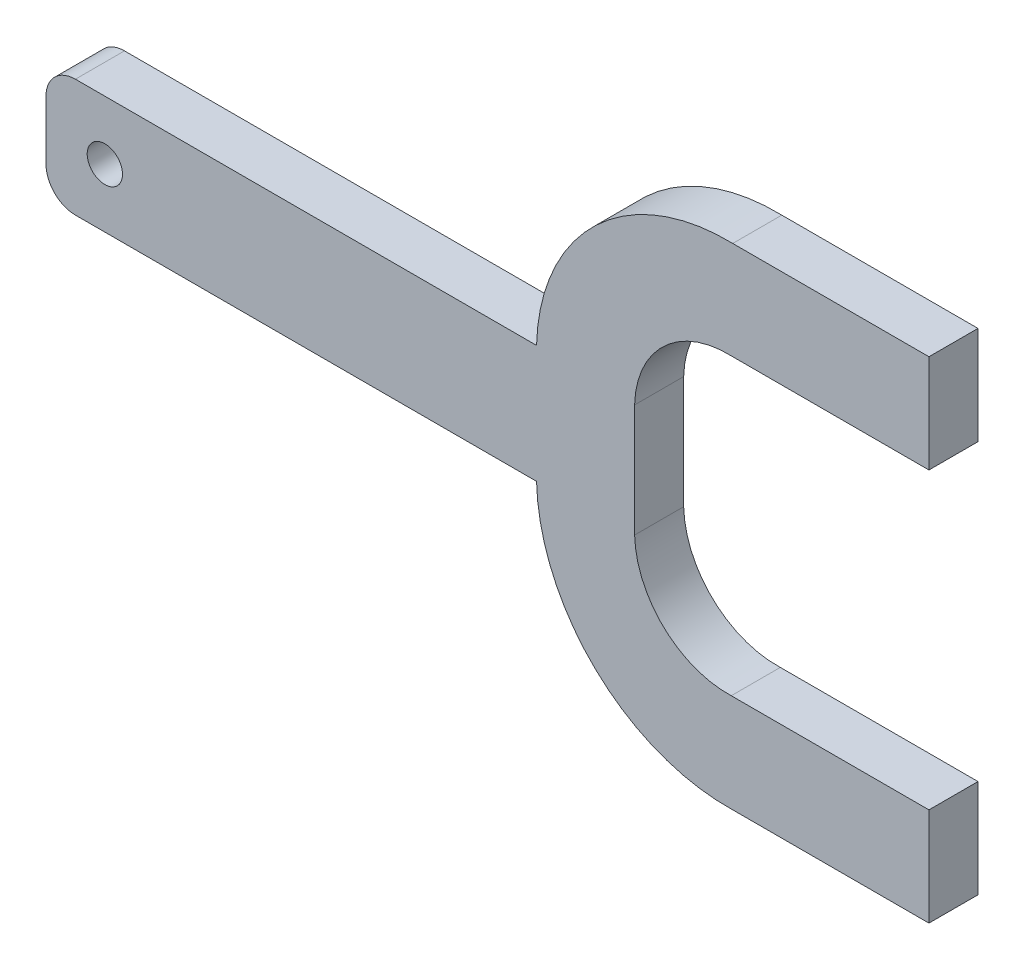
ISO-10303-21;
HEADER;
FILE_DESCRIPTION(('STEP AP214'),'2;1');
FILE_NAME('part.step','',(''),(''),'','','');
FILE_SCHEMA(('AUTOMOTIVE_DESIGN { 1 0 10303 214 1 1 1 1 }'));
ENDSEC;
DATA;
#1=APPLICATION_CONTEXT('core data for automotive mechanical design processes');
#2=APPLICATION_PROTOCOL_DEFINITION('international standard','automotive_design',2000,#1);
#3=PRODUCT_CONTEXT('',#1,'mechanical');
#4=PRODUCT('Part','Part','',(#3));
#5=PRODUCT_RELATED_PRODUCT_CATEGORY('part','',(#4));
#6=PRODUCT_DEFINITION_FORMATION('','',#4);
#7=PRODUCT_DEFINITION_CONTEXT('part definition',#1,'design');
#8=PRODUCT_DEFINITION('design','',#6,#7);
#9=PRODUCT_DEFINITION_SHAPE('','',#8);
#10=(LENGTH_UNIT() NAMED_UNIT(*) SI_UNIT(.MILLI.,.METRE.));
#11=(NAMED_UNIT(*) PLANE_ANGLE_UNIT() SI_UNIT($,.RADIAN.));
#12=(NAMED_UNIT(*) SI_UNIT($,.STERADIAN.) SOLID_ANGLE_UNIT());
#13=UNCERTAINTY_MEASURE_WITH_UNIT(LENGTH_MEASURE(1.E-05),#10,'distance_accuracy_value','');
#14=(GEOMETRIC_REPRESENTATION_CONTEXT(3) GLOBAL_UNCERTAINTY_ASSIGNED_CONTEXT((#13)) GLOBAL_UNIT_ASSIGNED_CONTEXT((#10,
#11,#12)) REPRESENTATION_CONTEXT('',''));
#15=CARTESIAN_POINT('',(0.,0.,0.));
#16=DIRECTION('',(0.,0.,1.));
#17=DIRECTION('',(1.,0.,0.));
#18=AXIS2_PLACEMENT_3D('',#15,#16,#17);
#19=CARTESIAN_POINT('',(3.,9.,5.));
#20=DIRECTION('',(0.,0.,-1.));
#21=DIRECTION('',(-1.,0.,0.));
#22=AXIS2_PLACEMENT_3D('',#19,#20,#21);
#23=CYLINDRICAL_SURFACE('',#22,3.);
#24=CARTESIAN_POINT('',(3.,9.,0.));
#25=DIRECTION('',(0.,0.,1.));
#26=DIRECTION('',(1.,0.,0.));
#27=AXIS2_PLACEMENT_3D('',#24,#25,#26);
#28=CIRCLE('',#27,3.);
#29=CARTESIAN_POINT('',(0.,8.99999999999998,0.));
#30=VERTEX_POINT('',#29);
#31=CARTESIAN_POINT('',(3.00000000000002,12.,0.));
#32=VERTEX_POINT('',#31);
#33=EDGE_CURVE('E214',#30,#32,#28,.F.);
#34=ORIENTED_EDGE('',*,*,#33,.F.);
#35=DIRECTION('',(0.,0.,-1.));
#36=VECTOR('',#35,1.);
#37=CARTESIAN_POINT('',(0.,8.99999999999998,5.));
#38=LINE('',#37,#36);
#39=CARTESIAN_POINT('',(0.,8.99999999999998,5.));
#40=VERTEX_POINT('',#39);
#41=EDGE_CURVE('E11',#40,#30,#38,.T.);
#42=ORIENTED_EDGE('',*,*,#41,.F.);
#43=CARTESIAN_POINT('',(3.,9.,5.));
#44=DIRECTION('',(0.,0.,1.));
#45=DIRECTION('',(1.,0.,0.));
#46=AXIS2_PLACEMENT_3D('',#43,#44,#45);
#47=CIRCLE('',#46,3.);
#48=CARTESIAN_POINT('',(3.00000000000002,12.,5.));
#49=VERTEX_POINT('',#48);
#50=EDGE_CURVE('E479',#40,#49,#47,.F.);
#51=ORIENTED_EDGE('',*,*,#50,.T.);
#52=DIRECTION('',(0.,0.,-1.));
#53=VECTOR('',#52,1.);
#54=CARTESIAN_POINT('',(3.00000000000002,12.,5.));
#55=LINE('',#54,#53);
#56=EDGE_CURVE('E52',#49,#32,#55,.T.);
#57=ORIENTED_EDGE('',*,*,#56,.T.);
#58=EDGE_LOOP('',(#34,#42,#51,#57));
#59=FACE_BOUND('',#58,.T.);
#60=ADVANCED_FACE('F35',(#59),#23,.T.);
#61=CARTESIAN_POINT('',(0.,0.,5.));
#62=DIRECTION('',(-1.,0.,0.));
#63=DIRECTION('',(0.,0.,1.));
#64=AXIS2_PLACEMENT_3D('',#61,#62,#63);
#65=PLANE('',#64);
#66=DIRECTION('',(0.,1.,0.));
#67=VECTOR('',#66,1.);
#68=CARTESIAN_POINT('',(0.,0.,0.));
#69=LINE('',#68,#67);
#70=CARTESIAN_POINT('',(0.,3.00000000000002,0.));
#71=VERTEX_POINT('',#70);
#72=EDGE_CURVE('E211',#71,#30,#69,.T.);
#73=ORIENTED_EDGE('',*,*,#72,.F.);
#74=DIRECTION('',(0.,0.,-1.));
#75=VECTOR('',#74,1.);
#76=CARTESIAN_POINT('',(0.,3.00000000000002,5.));
#77=LINE('',#76,#75);
#78=CARTESIAN_POINT('',(0.,3.00000000000002,5.));
#79=VERTEX_POINT('',#78);
#80=EDGE_CURVE('E44',#79,#71,#77,.T.);
#81=ORIENTED_EDGE('',*,*,#80,.F.);
#82=DIRECTION('',(0.,1.,0.));
#83=VECTOR('',#82,1.);
#84=CARTESIAN_POINT('',(0.,0.,5.));
#85=LINE('',#84,#83);
#86=EDGE_CURVE('E477',#79,#40,#85,.T.);
#87=ORIENTED_EDGE('',*,*,#86,.T.);
#88=ORIENTED_EDGE('',*,*,#41,.T.);
#89=EDGE_LOOP('',(#73,#81,#87,#88));
#90=FACE_BOUND('',#89,.T.);
#91=ADVANCED_FACE('F212',(#90),#65,.T.);
#92=CARTESIAN_POINT('',(3.,3.,5.));
#93=DIRECTION('',(0.,0.,-1.));
#94=DIRECTION('',(-1.,0.,0.));
#95=AXIS2_PLACEMENT_3D('',#92,#93,#94);
#96=CYLINDRICAL_SURFACE('',#95,3.);
#97=CARTESIAN_POINT('',(3.,3.,0.));
#98=DIRECTION('',(0.,0.,1.));
#99=DIRECTION('',(1.,0.,0.));
#100=AXIS2_PLACEMENT_3D('',#97,#98,#99);
#101=CIRCLE('',#100,3.);
#102=CARTESIAN_POINT('',(3.00000000000002,0.,0.));
#103=VERTEX_POINT('',#102);
#104=EDGE_CURVE('E204',#103,#71,#101,.F.);
#105=ORIENTED_EDGE('',*,*,#104,.F.);
#106=DIRECTION('',(0.,0.,-1.));
#107=VECTOR('',#106,1.);
#108=CARTESIAN_POINT('',(3.00000000000002,0.,5.));
#109=LINE('',#108,#107);
#110=CARTESIAN_POINT('',(3.00000000000002,0.,5.));
#111=VERTEX_POINT('',#110);
#112=EDGE_CURVE('E197',#111,#103,#109,.T.);
#113=ORIENTED_EDGE('',*,*,#112,.F.);
#114=CARTESIAN_POINT('',(3.,3.,5.));
#115=DIRECTION('',(0.,0.,1.));
#116=DIRECTION('',(1.,0.,0.));
#117=AXIS2_PLACEMENT_3D('',#114,#115,#116);
#118=CIRCLE('',#117,3.);
#119=EDGE_CURVE('E206',#111,#79,#118,.F.);
#120=ORIENTED_EDGE('',*,*,#119,.T.);
#121=ORIENTED_EDGE('',*,*,#80,.T.);
#122=EDGE_LOOP('',(#105,#113,#120,#121));
#123=FACE_BOUND('',#122,.T.);
#124=ADVANCED_FACE('F202',(#123),#96,.T.);
#125=CARTESIAN_POINT('',(0.,0.,5.));
#126=DIRECTION('',(0.,1.,0.));
#127=DIRECTION('',(0.,0.,1.));
#128=AXIS2_PLACEMENT_3D('',#125,#126,#127);
#129=PLANE('',#128);
#130=DIRECTION('',(1.,0.,0.));
#131=VECTOR('',#130,1.);
#132=CARTESIAN_POINT('',(0.,0.,0.));
#133=LINE('',#132,#131);
#134=CARTESIAN_POINT('',(50.,0.,0.));
#135=VERTEX_POINT('',#134);
#136=EDGE_CURVE('E220',#103,#135,#133,.T.);
#137=ORIENTED_EDGE('',*,*,#136,.T.);
#138=DIRECTION('',(0.,0.,-1.));
#139=VECTOR('',#138,1.);
#140=CARTESIAN_POINT('',(50.,0.,5.));
#141=LINE('',#140,#139);
#142=CARTESIAN_POINT('',(50.,0.,5.));
#143=VERTEX_POINT('',#142);
#144=EDGE_CURVE('E195',#143,#135,#141,.T.);
#145=ORIENTED_EDGE('',*,*,#144,.F.);
#146=DIRECTION('',(1.,0.,0.));
#147=VECTOR('',#146,1.);
#148=CARTESIAN_POINT('',(0.,0.,5.));
#149=LINE('',#148,#147);
#150=EDGE_CURVE('E475',#111,#143,#149,.T.);
#151=ORIENTED_EDGE('',*,*,#150,.F.);
#152=ORIENTED_EDGE('',*,*,#112,.T.);
#153=EDGE_LOOP('',(#137,#145,#151,#152));
#154=FACE_BOUND('',#153,.T.);
#155=ADVANCED_FACE('F281',(#154),#129,.F.);
#156=CARTESIAN_POINT('',(69.5,0.500000000000016,5.));
#157=DIRECTION('',(0.,0.,-1.));
#158=DIRECTION('',(-1.,0.,0.));
#159=AXIS2_PLACEMENT_3D('',#156,#157,#158);
#160=CYLINDRICAL_SURFACE('',#159,19.5064092031312);
#161=CARTESIAN_POINT('',(69.5,0.500000000000016,0.));
#162=DIRECTION('',(0.,0.,1.));
#163=DIRECTION('',(1.,0.,0.));
#164=AXIS2_PLACEMENT_3D('',#161,#162,#163);
#165=CIRCLE('',#164,19.5064092031312);
#166=CARTESIAN_POINT('',(70.,-19.,0.));
#167=VERTEX_POINT('',#166);
#168=EDGE_CURVE('E222',#167,#135,#165,.F.);
#169=ORIENTED_EDGE('',*,*,#168,.F.);
#170=DIRECTION('',(0.,0.,-1.));
#171=VECTOR('',#170,1.);
#172=CARTESIAN_POINT('',(70.,-19.,5.));
#173=LINE('',#172,#171);
#174=CARTESIAN_POINT('',(70.,-19.,5.));
#175=VERTEX_POINT('',#174);
#176=EDGE_CURVE('E193',#175,#167,#173,.T.);
#177=ORIENTED_EDGE('',*,*,#176,.F.);
#178=CARTESIAN_POINT('',(69.5,0.500000000000016,5.));
#179=DIRECTION('',(0.,0.,1.));
#180=DIRECTION('',(1.,0.,0.));
#181=AXIS2_PLACEMENT_3D('',#178,#179,#180);
#182=CIRCLE('',#181,19.5064092031312);
#183=EDGE_CURVE('E473',#175,#143,#182,.F.);
#184=ORIENTED_EDGE('',*,*,#183,.T.);
#185=ORIENTED_EDGE('',*,*,#144,.T.);
#186=EDGE_LOOP('',(#169,#177,#184,#185));
#187=FACE_BOUND('',#186,.T.);
#188=ADVANCED_FACE('F284',(#187),#160,.T.);
#189=CARTESIAN_POINT('',(0.,-19.,5.));
#190=DIRECTION('',(0.,-1.,0.));
#191=DIRECTION('',(0.,0.,-1.));
#192=AXIS2_PLACEMENT_3D('',#189,#190,#191);
#193=PLANE('',#192);
#194=DIRECTION('',(-1.,0.,0.));
#195=VECTOR('',#194,1.);
#196=CARTESIAN_POINT('',(0.,-19.,0.));
#197=LINE('',#196,#195);
#198=CARTESIAN_POINT('',(90.,-19.,0.));
#199=VERTEX_POINT('',#198);
#200=EDGE_CURVE('E227',#199,#167,#197,.T.);
#201=ORIENTED_EDGE('',*,*,#200,.F.);
#202=DIRECTION('',(0.,0.,-1.));
#203=VECTOR('',#202,1.);
#204=CARTESIAN_POINT('',(90.,-19.,5.));
#205=LINE('',#204,#203);
#206=CARTESIAN_POINT('',(90.,-19.,5.));
#207=VERTEX_POINT('',#206);
#208=EDGE_CURVE('E191',#207,#199,#205,.T.);
#209=ORIENTED_EDGE('',*,*,#208,.F.);
#210=DIRECTION('',(-1.,0.,0.));
#211=VECTOR('',#210,1.);
#212=CARTESIAN_POINT('',(0.,-19.,5.));
#213=LINE('',#212,#211);
#214=EDGE_CURVE('E469',#207,#175,#213,.T.);
#215=ORIENTED_EDGE('',*,*,#214,.T.);
#216=ORIENTED_EDGE('',*,*,#176,.T.);
#217=EDGE_LOOP('',(#201,#209,#215,#216));
#218=FACE_BOUND('',#217,.T.);
#219=ADVANCED_FACE('F288',(#218),#193,.T.);
#220=CARTESIAN_POINT('',(90.,0.,5.));
#221=DIRECTION('',(1.,0.,0.));
#222=DIRECTION('',(0.,0.,-1.));
#223=AXIS2_PLACEMENT_3D('',#220,#221,#222);
#224=PLANE('',#223);
#225=DIRECTION('',(0.,-1.,0.));
#226=VECTOR('',#225,1.);
#227=CARTESIAN_POINT('',(90.,0.,0.));
#228=LINE('',#227,#226);
#229=CARTESIAN_POINT('',(90.,-9.,0.));
#230=VERTEX_POINT('',#229);
#231=EDGE_CURVE('E230',#230,#199,#228,.T.);
#232=ORIENTED_EDGE('',*,*,#231,.F.);
#233=DIRECTION('',(0.,0.,-1.));
#234=VECTOR('',#233,1.);
#235=CARTESIAN_POINT('',(90.,-9.,5.));
#236=LINE('',#235,#234);
#237=CARTESIAN_POINT('',(90.,-9.,5.));
#238=VERTEX_POINT('',#237);
#239=EDGE_CURVE('E189',#238,#230,#236,.T.);
#240=ORIENTED_EDGE('',*,*,#239,.F.);
#241=DIRECTION('',(0.,-1.,0.));
#242=VECTOR('',#241,1.);
#243=CARTESIAN_POINT('',(90.,0.,5.));
#244=LINE('',#243,#242);
#245=EDGE_CURVE('E464',#238,#207,#244,.T.);
#246=ORIENTED_EDGE('',*,*,#245,.T.);
#247=ORIENTED_EDGE('',*,*,#208,.T.);
#248=EDGE_LOOP('',(#232,#240,#246,#247));
#249=FACE_BOUND('',#248,.T.);
#250=ADVANCED_FACE('F292',(#249),#224,.T.);
#251=CARTESIAN_POINT('',(0.,-9.,5.));
#252=DIRECTION('',(0.,-1.,0.));
#253=DIRECTION('',(0.,0.,-1.));
#254=AXIS2_PLACEMENT_3D('',#251,#252,#253);
#255=PLANE('',#254);
#256=DIRECTION('',(-1.,0.,0.));
#257=VECTOR('',#256,1.);
#258=CARTESIAN_POINT('',(0.,-9.,0.));
#259=LINE('',#258,#257);
#260=CARTESIAN_POINT('',(69.8490213995972,-9.,0.));
#261=VERTEX_POINT('',#260);
#262=EDGE_CURVE('E233',#230,#261,#259,.T.);
#263=ORIENTED_EDGE('',*,*,#262,.T.);
#264=DIRECTION('',(0.,0.,-1.));
#265=VECTOR('',#264,1.);
#266=CARTESIAN_POINT('',(69.8490213995972,-9.,5.));
#267=LINE('',#266,#265);
#268=CARTESIAN_POINT('',(69.8490213995972,-9.,5.));
#269=VERTEX_POINT('',#268);
#270=EDGE_CURVE('E186',#269,#261,#267,.T.);
#271=ORIENTED_EDGE('',*,*,#270,.F.);
#272=DIRECTION('',(-1.,0.,0.));
#273=VECTOR('',#272,1.);
#274=CARTESIAN_POINT('',(0.,-9.,5.));
#275=LINE('',#274,#273);
#276=EDGE_CURVE('E461',#238,#269,#275,.T.);
#277=ORIENTED_EDGE('',*,*,#276,.F.);
#278=ORIENTED_EDGE('',*,*,#239,.T.);
#279=EDGE_LOOP('',(#263,#271,#277,#278));
#280=FACE_BOUND('',#279,.T.);
#281=ADVANCED_FACE('F296',(#280),#255,.F.);
#282=CARTESIAN_POINT('',(69.5,0.500000000000016,5.));
#283=DIRECTION('',(0.,0.,-1.));
#284=DIRECTION('',(-1.,0.,0.));
#285=AXIS2_PLACEMENT_3D('',#282,#283,#284);
#286=CYLINDRICAL_SURFACE('',#285,9.50640920313118);
#287=CARTESIAN_POINT('',(69.5,0.500000000000016,0.));
#288=DIRECTION('',(0.,0.,1.));
#289=DIRECTION('',(1.,0.,0.));
#290=AXIS2_PLACEMENT_3D('',#287,#288,#289);
#291=CIRCLE('',#290,9.50640920313118);
#292=CARTESIAN_POINT('',(59.9967143090948,0.256326007925519,0.));
#293=VERTEX_POINT('',#292);
#294=EDGE_CURVE('E236',#261,#293,#291,.F.);
#295=ORIENTED_EDGE('',*,*,#294,.T.);
#296=DIRECTION('',(0.,0.,-1.));
#297=VECTOR('',#296,1.);
#298=CARTESIAN_POINT('',(59.9967143090948,0.256326007925519,5.));
#299=LINE('',#298,#297);
#300=CARTESIAN_POINT('',(59.9967143090948,0.256326007925519,5.));
#301=VERTEX_POINT('',#300);
#302=EDGE_CURVE('E184',#301,#293,#299,.T.);
#303=ORIENTED_EDGE('',*,*,#302,.F.);
#304=CARTESIAN_POINT('',(69.5,0.500000000000016,5.));
#305=DIRECTION('',(0.,0.,1.));
#306=DIRECTION('',(1.,0.,0.));
#307=AXIS2_PLACEMENT_3D('',#304,#305,#306);
#308=CIRCLE('',#307,9.50640920313118);
#309=EDGE_CURVE('E458',#269,#301,#308,.F.);
#310=ORIENTED_EDGE('',*,*,#309,.F.);
#311=ORIENTED_EDGE('',*,*,#270,.T.);
#312=EDGE_LOOP('',(#295,#303,#310,#311));
#313=FACE_BOUND('',#312,.T.);
#314=ADVANCED_FACE('F300',(#313),#286,.F.);
#315=CARTESIAN_POINT('',(59.9967143090948,0.,5.));
#316=DIRECTION('',(1.,0.,0.));
#317=DIRECTION('',(0.,0.,-1.));
#318=AXIS2_PLACEMENT_3D('',#315,#316,#317);
#319=PLANE('',#318);
#320=DIRECTION('',(0.,-1.,0.));
#321=VECTOR('',#320,1.);
#322=CARTESIAN_POINT('',(59.9967143090948,0.,0.));
#323=LINE('',#322,#321);
#324=CARTESIAN_POINT('',(59.9967143090948,11.7436739920745,0.));
#325=VERTEX_POINT('',#324);
#326=EDGE_CURVE('E239',#325,#293,#323,.T.);
#327=ORIENTED_EDGE('',*,*,#326,.F.);
#328=DIRECTION('',(0.,0.,-1.));
#329=VECTOR('',#328,1.);
#330=CARTESIAN_POINT('',(59.9967143090948,11.7436739920745,5.));
#331=LINE('',#330,#329);
#332=CARTESIAN_POINT('',(59.9967143090948,11.7436739920745,5.));
#333=VERTEX_POINT('',#332);
#334=EDGE_CURVE('E182',#333,#325,#331,.T.);
#335=ORIENTED_EDGE('',*,*,#334,.F.);
#336=DIRECTION('',(0.,-1.,0.));
#337=VECTOR('',#336,1.);
#338=CARTESIAN_POINT('',(59.9967143090948,0.,5.));
#339=LINE('',#338,#337);
#340=EDGE_CURVE('E488',#333,#301,#339,.T.);
#341=ORIENTED_EDGE('',*,*,#340,.T.);
#342=ORIENTED_EDGE('',*,*,#302,.T.);
#343=EDGE_LOOP('',(#327,#335,#341,#342));
#344=FACE_BOUND('',#343,.T.);
#345=ADVANCED_FACE('F304',(#344),#319,.T.);
#346=CARTESIAN_POINT('',(69.5,11.5,5.));
#347=DIRECTION('',(0.,0.,-1.));
#348=DIRECTION('',(-1.,0.,0.));
#349=AXIS2_PLACEMENT_3D('',#346,#347,#348);
#350=CYLINDRICAL_SURFACE('',#349,9.50640920313118);
#351=CARTESIAN_POINT('',(69.5,11.5,0.));
#352=DIRECTION('',(0.,0.,1.));
#353=DIRECTION('',(1.,0.,0.));
#354=AXIS2_PLACEMENT_3D('',#351,#352,#353);
#355=CIRCLE('',#354,9.50640920313118);
#356=CARTESIAN_POINT('',(69.8490213995973,21.,0.));
#357=VERTEX_POINT('',#356);
#358=EDGE_CURVE('E242',#357,#325,#355,.T.);
#359=ORIENTED_EDGE('',*,*,#358,.F.);
#360=DIRECTION('',(0.,0.,-1.));
#361=VECTOR('',#360,1.);
#362=CARTESIAN_POINT('',(69.8490213995973,21.,5.));
#363=LINE('',#362,#361);
#364=CARTESIAN_POINT('',(69.8490213995973,21.,5.));
#365=VERTEX_POINT('',#364);
#366=EDGE_CURVE('E180',#365,#357,#363,.T.);
#367=ORIENTED_EDGE('',*,*,#366,.F.);
#368=CARTESIAN_POINT('',(69.5,11.5,5.));
#369=DIRECTION('',(0.,0.,1.));
#370=DIRECTION('',(1.,0.,0.));
#371=AXIS2_PLACEMENT_3D('',#368,#369,#370);
#372=CIRCLE('',#371,9.50640920313118);
#373=EDGE_CURVE('E451',#365,#333,#372,.T.);
#374=ORIENTED_EDGE('',*,*,#373,.T.);
#375=ORIENTED_EDGE('',*,*,#334,.T.);
#376=EDGE_LOOP('',(#359,#367,#374,#375));
#377=FACE_BOUND('',#376,.T.);
#378=ADVANCED_FACE('F308',(#377),#350,.F.);
#379=CARTESIAN_POINT('',(0.,21.,5.));
#380=DIRECTION('',(0.,-1.,0.));
#381=DIRECTION('',(0.,0.,-1.));
#382=AXIS2_PLACEMENT_3D('',#379,#380,#381);
#383=PLANE('',#382);
#384=DIRECTION('',(-1.,0.,0.));
#385=VECTOR('',#384,1.);
#386=CARTESIAN_POINT('',(0.,21.,0.));
#387=LINE('',#386,#385);
#388=CARTESIAN_POINT('',(90.,21.,0.));
#389=VERTEX_POINT('',#388);
#390=EDGE_CURVE('E245',#389,#357,#387,.T.);
#391=ORIENTED_EDGE('',*,*,#390,.F.);
#392=DIRECTION('',(0.,0.,-1.));
#393=VECTOR('',#392,1.);
#394=CARTESIAN_POINT('',(90.,21.,5.));
#395=LINE('',#394,#393);
#396=CARTESIAN_POINT('',(90.,21.,5.));
#397=VERTEX_POINT('',#396);
#398=EDGE_CURVE('E174',#397,#389,#395,.T.);
#399=ORIENTED_EDGE('',*,*,#398,.F.);
#400=DIRECTION('',(-1.,0.,0.));
#401=VECTOR('',#400,1.);
#402=CARTESIAN_POINT('',(0.,21.,5.));
#403=LINE('',#402,#401);
#404=EDGE_CURVE('E447',#397,#365,#403,.T.);
#405=ORIENTED_EDGE('',*,*,#404,.T.);
#406=ORIENTED_EDGE('',*,*,#366,.T.);
#407=EDGE_LOOP('',(#391,#399,#405,#406));
#408=FACE_BOUND('',#407,.T.);
#409=ADVANCED_FACE('F312',(#408),#383,.T.);
#410=CARTESIAN_POINT('',(90.,0.,5.));
#411=DIRECTION('',(1.,0.,0.));
#412=DIRECTION('',(0.,0.,-1.));
#413=AXIS2_PLACEMENT_3D('',#410,#411,#412);
#414=PLANE('',#413);
#415=DIRECTION('',(0.,-1.,0.));
#416=VECTOR('',#415,1.);
#417=CARTESIAN_POINT('',(90.,0.,0.));
#418=LINE('',#417,#416);
#419=CARTESIAN_POINT('',(90.,31.,0.));
#420=VERTEX_POINT('',#419);
#421=EDGE_CURVE('E248',#420,#389,#418,.T.);
#422=ORIENTED_EDGE('',*,*,#421,.F.);
#423=DIRECTION('',(0.,0.,-1.));
#424=VECTOR('',#423,1.);
#425=CARTESIAN_POINT('',(90.,31.,5.));
#426=LINE('',#425,#424);
#427=CARTESIAN_POINT('',(90.,31.,5.));
#428=VERTEX_POINT('',#427);
#429=EDGE_CURVE('E172',#428,#420,#426,.T.);
#430=ORIENTED_EDGE('',*,*,#429,.F.);
#431=DIRECTION('',(0.,-1.,0.));
#432=VECTOR('',#431,1.);
#433=CARTESIAN_POINT('',(90.,0.,5.));
#434=LINE('',#433,#432);
#435=EDGE_CURVE('E166',#428,#397,#434,.T.);
#436=ORIENTED_EDGE('',*,*,#435,.T.);
#437=ORIENTED_EDGE('',*,*,#398,.T.);
#438=EDGE_LOOP('',(#422,#430,#436,#437));
#439=FACE_BOUND('',#438,.T.);
#440=ADVANCED_FACE('F316',(#439),#414,.T.);
#441=CARTESIAN_POINT('',(0.,31.,5.));
#442=DIRECTION('',(0.,-1.,0.));
#443=DIRECTION('',(0.,0.,-1.));
#444=AXIS2_PLACEMENT_3D('',#441,#442,#443);
#445=PLANE('',#444);
#446=DIRECTION('',(-1.,0.,0.));
#447=VECTOR('',#446,1.);
#448=CARTESIAN_POINT('',(0.,31.,0.));
#449=LINE('',#448,#447);
#450=CARTESIAN_POINT('',(70.,31.,0.));
#451=VERTEX_POINT('',#450);
#452=EDGE_CURVE('E171',#420,#451,#449,.T.);
#453=ORIENTED_EDGE('',*,*,#452,.T.);
#454=DIRECTION('',(0.,0.,-1.));
#455=VECTOR('',#454,1.);
#456=CARTESIAN_POINT('',(70.,31.,5.));
#457=LINE('',#456,#455);
#458=CARTESIAN_POINT('',(70.,31.,5.));
#459=VERTEX_POINT('',#458);
#460=EDGE_CURVE('E154',#459,#451,#457,.T.);
#461=ORIENTED_EDGE('',*,*,#460,.F.);
#462=DIRECTION('',(-1.,0.,0.));
#463=VECTOR('',#462,1.);
#464=CARTESIAN_POINT('',(0.,31.,5.));
#465=LINE('',#464,#463);
#466=EDGE_CURVE('E159',#428,#459,#465,.T.);
#467=ORIENTED_EDGE('',*,*,#466,.F.);
#468=ORIENTED_EDGE('',*,*,#429,.T.);
#469=EDGE_LOOP('',(#453,#461,#467,#468));
#470=FACE_BOUND('',#469,.T.);
#471=ADVANCED_FACE('F169',(#470),#445,.F.);
#472=CARTESIAN_POINT('',(69.5,11.5,5.));
#473=DIRECTION('',(0.,0.,-1.));
#474=DIRECTION('',(-1.,0.,0.));
#475=AXIS2_PLACEMENT_3D('',#472,#473,#474);
#476=CYLINDRICAL_SURFACE('',#475,19.5064092031312);
#477=CARTESIAN_POINT('',(69.5,11.5,0.));
#478=DIRECTION('',(0.,0.,1.));
#479=DIRECTION('',(1.,0.,0.));
#480=AXIS2_PLACEMENT_3D('',#477,#478,#479);
#481=CIRCLE('',#480,19.5064092031312);
#482=CARTESIAN_POINT('',(50.,12.,0.));
#483=VERTEX_POINT('',#482);
#484=EDGE_CURVE('E252',#451,#483,#481,.T.);
#485=ORIENTED_EDGE('',*,*,#484,.T.);
#486=DIRECTION('',(0.,0.,-1.));
#487=VECTOR('',#486,1.);
#488=CARTESIAN_POINT('',(50.,12.,5.));
#489=LINE('',#488,#487);
#490=CARTESIAN_POINT('',(50.,12.,5.));
#491=VERTEX_POINT('',#490);
#492=EDGE_CURVE('E102',#491,#483,#489,.T.);
#493=ORIENTED_EDGE('',*,*,#492,.F.);
#494=CARTESIAN_POINT('',(69.5,11.5,5.));
#495=DIRECTION('',(0.,0.,1.));
#496=DIRECTION('',(1.,0.,0.));
#497=AXIS2_PLACEMENT_3D('',#494,#495,#496);
#498=CIRCLE('',#497,19.5064092031312);
#499=EDGE_CURVE('E150',#459,#491,#498,.T.);
#500=ORIENTED_EDGE('',*,*,#499,.F.);
#501=ORIENTED_EDGE('',*,*,#460,.T.);
#502=EDGE_LOOP('',(#485,#493,#500,#501));
#503=FACE_BOUND('',#502,.T.);
#504=ADVANCED_FACE('F152',(#503),#476,.T.);
#505=CARTESIAN_POINT('',(6.,6.,5.));
#506=DIRECTION('',(0.,0.,-1.));
#507=DIRECTION('',(-1.,0.,0.));
#508=AXIS2_PLACEMENT_3D('',#505,#506,#507);
#509=CYLINDRICAL_SURFACE('',#508,1.8);
#510=CARTESIAN_POINT('',(6.,6.,5.));
#511=DIRECTION('',(0.,0.,1.));
#512=DIRECTION('',(1.,0.,0.));
#513=AXIS2_PLACEMENT_3D('',#510,#511,#512);
#514=CIRCLE('',#513,1.8);
#515=CARTESIAN_POINT('',(7.8,6.,5.));
#516=VERTEX_POINT('',#515);
#517=EDGE_CURVE('E256',#516,#516,#514,.T.);
#518=ORIENTED_EDGE('',*,*,#517,.T.);
#519=EDGE_LOOP('',(#518));
#520=FACE_BOUND('',#519,.T.);
#521=CARTESIAN_POINT('',(6.,6.,0.));
#522=DIRECTION('',(0.,0.,1.));
#523=DIRECTION('',(1.,0.,0.));
#524=AXIS2_PLACEMENT_3D('',#521,#522,#523);
#525=CIRCLE('',#524,1.8);
#526=CARTESIAN_POINT('',(7.8,6.,0.));
#527=VERTEX_POINT('',#526);
#528=EDGE_CURVE('E259',#527,#527,#525,.T.);
#529=ORIENTED_EDGE('',*,*,#528,.F.);
#530=EDGE_LOOP('',(#529));
#531=FACE_BOUND('',#530,.T.);
#532=ADVANCED_FACE('F37',(#520,#531),#509,.F.);
#533=CARTESIAN_POINT('',(0.,12.,5.));
#534=DIRECTION('',(0.,1.,0.));
#535=DIRECTION('',(0.,0.,1.));
#536=AXIS2_PLACEMENT_3D('',#533,#534,#535);
#537=PLANE('',#536);
#538=DIRECTION('',(1.,0.,0.));
#539=VECTOR('',#538,1.);
#540=CARTESIAN_POINT('',(0.,12.,0.));
#541=LINE('',#540,#539);
#542=EDGE_CURVE('E254',#32,#483,#541,.T.);
#543=ORIENTED_EDGE('',*,*,#542,.F.);
#544=ORIENTED_EDGE('',*,*,#56,.F.);
#545=DIRECTION('',(1.,0.,0.));
#546=VECTOR('',#545,1.);
#547=CARTESIAN_POINT('',(0.,12.,5.));
#548=LINE('',#547,#546);
#549=EDGE_CURVE('E158',#49,#491,#548,.T.);
#550=ORIENTED_EDGE('',*,*,#549,.T.);
#551=ORIENTED_EDGE('',*,*,#492,.T.);
#552=EDGE_LOOP('',(#543,#544,#550,#551));
#553=FACE_BOUND('',#552,.T.);
#554=ADVANCED_FACE('F261',(#553),#537,.T.);
#555=CARTESIAN_POINT('',(0.,0.,5.));
#556=DIRECTION('',(0.,0.,1.));
#557=DIRECTION('',(1.,0.,0.));
#558=AXIS2_PLACEMENT_3D('',#555,#556,#557);
#559=PLANE('',#558);
#560=ORIENTED_EDGE('',*,*,#517,.F.);
#561=EDGE_LOOP('',(#560));
#562=FACE_BOUND('',#561,.T.);
#563=ORIENTED_EDGE('',*,*,#50,.F.);
#564=ORIENTED_EDGE('',*,*,#86,.F.);
#565=ORIENTED_EDGE('',*,*,#119,.F.);
#566=ORIENTED_EDGE('',*,*,#150,.T.);
#567=ORIENTED_EDGE('',*,*,#183,.F.);
#568=ORIENTED_EDGE('',*,*,#214,.F.);
#569=ORIENTED_EDGE('',*,*,#245,.F.);
#570=ORIENTED_EDGE('',*,*,#276,.T.);
#571=ORIENTED_EDGE('',*,*,#309,.T.);
#572=ORIENTED_EDGE('',*,*,#340,.F.);
#573=ORIENTED_EDGE('',*,*,#373,.F.);
#574=ORIENTED_EDGE('',*,*,#404,.F.);
#575=ORIENTED_EDGE('',*,*,#435,.F.);
#576=ORIENTED_EDGE('',*,*,#466,.T.);
#577=ORIENTED_EDGE('',*,*,#499,.T.);
#578=ORIENTED_EDGE('',*,*,#549,.F.);
#579=EDGE_LOOP('',(#563,#564,#565,#566,#567,#568,#569,#570,#571,#572,#573,#574,#575,#576,#577,#578));
#580=FACE_BOUND('',#579,.T.);
#581=ADVANCED_FACE('F163',(#562,#580),#559,.T.);
#582=CARTESIAN_POINT('',(0.,0.,0.));
#583=DIRECTION('',(0.,0.,1.));
#584=DIRECTION('',(1.,0.,0.));
#585=AXIS2_PLACEMENT_3D('',#582,#583,#584);
#586=PLANE('',#585);
#587=ORIENTED_EDGE('',*,*,#528,.T.);
#588=EDGE_LOOP('',(#587));
#589=FACE_BOUND('',#588,.T.);
#590=ORIENTED_EDGE('',*,*,#33,.T.);
#591=ORIENTED_EDGE('',*,*,#542,.T.);
#592=ORIENTED_EDGE('',*,*,#484,.F.);
#593=ORIENTED_EDGE('',*,*,#452,.F.);
#594=ORIENTED_EDGE('',*,*,#421,.T.);
#595=ORIENTED_EDGE('',*,*,#390,.T.);
#596=ORIENTED_EDGE('',*,*,#358,.T.);
#597=ORIENTED_EDGE('',*,*,#326,.T.);
#598=ORIENTED_EDGE('',*,*,#294,.F.);
#599=ORIENTED_EDGE('',*,*,#262,.F.);
#600=ORIENTED_EDGE('',*,*,#231,.T.);
#601=ORIENTED_EDGE('',*,*,#200,.T.);
#602=ORIENTED_EDGE('',*,*,#168,.T.);
#603=ORIENTED_EDGE('',*,*,#136,.F.);
#604=ORIENTED_EDGE('',*,*,#104,.T.);
#605=ORIENTED_EDGE('',*,*,#72,.T.);
#606=EDGE_LOOP('',(#590,#591,#592,#593,#594,#595,#596,#597,#598,#599,#600,#601,#602,#603,#604,#605));
#607=FACE_BOUND('',#606,.T.);
#608=ADVANCED_FACE('F217',(#589,#607),#586,.F.);
#609=CLOSED_SHELL('',(#60,#91,#124,#155,#188,#219,#250,#281,#314,#345,#378,#409,#440,#471,#504,
#532,#554,#581,#608));
#610=MANIFOLD_SOLID_BREP('B2',#609);
#611=ADVANCED_BREP_SHAPE_REPRESENTATION('',(#18,#610),#14);
#612=SHAPE_DEFINITION_REPRESENTATION(#9,#611);
ENDSEC;
END-ISO-10303-21;
